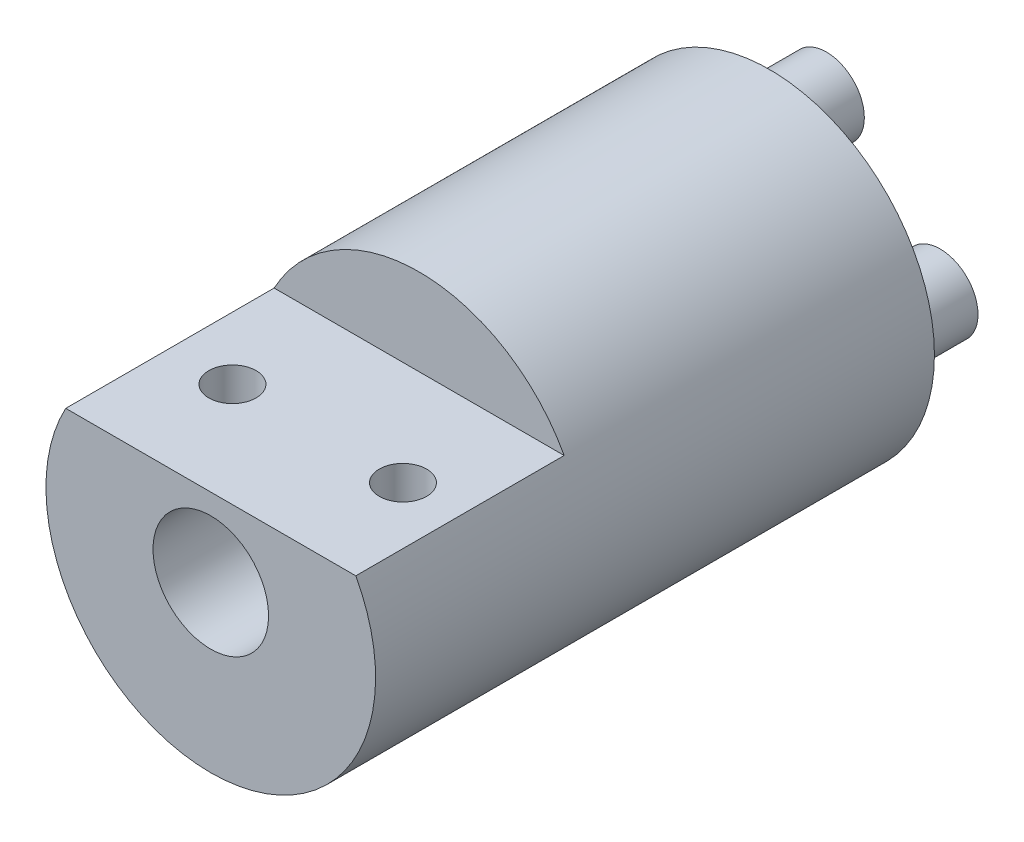
ISO-10303-21;
HEADER;
FILE_DESCRIPTION(('STEP AP214'),'2;1');
FILE_NAME('part.step','',(''),(''),'','','');
FILE_SCHEMA(('AUTOMOTIVE_DESIGN { 1 0 10303 214 1 1 1 1 }'));
ENDSEC;
DATA;
#1=APPLICATION_CONTEXT('core data for automotive mechanical design processes');
#2=APPLICATION_PROTOCOL_DEFINITION('international standard','automotive_design',2000,#1);
#3=PRODUCT_CONTEXT('',#1,'mechanical');
#4=PRODUCT('Part','Part','',(#3));
#5=PRODUCT_RELATED_PRODUCT_CATEGORY('part','',(#4));
#6=PRODUCT_DEFINITION_FORMATION('','',#4);
#7=PRODUCT_DEFINITION_CONTEXT('part definition',#1,'design');
#8=PRODUCT_DEFINITION('design','',#6,#7);
#9=PRODUCT_DEFINITION_SHAPE('','',#8);
#10=(LENGTH_UNIT() NAMED_UNIT(*) SI_UNIT(.MILLI.,.METRE.));
#11=(NAMED_UNIT(*) PLANE_ANGLE_UNIT() SI_UNIT($,.RADIAN.));
#12=(NAMED_UNIT(*) SI_UNIT($,.STERADIAN.) SOLID_ANGLE_UNIT());
#13=UNCERTAINTY_MEASURE_WITH_UNIT(LENGTH_MEASURE(1.E-05),#10,'distance_accuracy_value','');
#14=(GEOMETRIC_REPRESENTATION_CONTEXT(3) GLOBAL_UNCERTAINTY_ASSIGNED_CONTEXT((#13)) GLOBAL_UNIT_ASSIGNED_CONTEXT((#10,
#11,#12)) REPRESENTATION_CONTEXT('',''));
#15=CARTESIAN_POINT('',(0.,0.,0.));
#16=DIRECTION('',(0.,0.,1.));
#17=DIRECTION('',(1.,0.,0.));
#18=AXIS2_PLACEMENT_3D('',#15,#16,#17);
#19=CARTESIAN_POINT('',(0.,0.,29.5));
#20=DIRECTION('',(0.,0.,-1.));
#21=DIRECTION('',(-1.,0.,0.));
#22=AXIS2_PLACEMENT_3D('',#19,#20,#21);
#23=CYLINDRICAL_SURFACE('',#22,1.75);
#24=CARTESIAN_POINT('',(0.,0.,2.7));
#25=DIRECTION('',(0.,0.,1.));
#26=DIRECTION('',(1.,0.,0.));
#27=AXIS2_PLACEMENT_3D('',#24,#25,#26);
#28=CIRCLE('',#27,1.75);
#29=CARTESIAN_POINT('',(1.75,0.,2.7));
#30=VERTEX_POINT('',#29);
#31=EDGE_CURVE('E96',#30,#30,#28,.T.);
#32=ORIENTED_EDGE('',*,*,#31,.T.);
#33=EDGE_LOOP('',(#32));
#34=FACE_BOUND('',#33,.T.);
#35=CARTESIAN_POINT('',(0.,0.,0.));
#36=DIRECTION('',(0.,0.,-1.));
#37=DIRECTION('',(-1.,0.,0.));
#38=AXIS2_PLACEMENT_3D('',#35,#36,#37);
#39=CIRCLE('',#38,1.75);
#40=CARTESIAN_POINT('',(-1.75,0.,0.));
#41=VERTEX_POINT('',#40);
#42=EDGE_CURVE('E87',#41,#41,#39,.T.);
#43=ORIENTED_EDGE('',*,*,#42,.T.);
#44=EDGE_LOOP('',(#43));
#45=FACE_BOUND('',#44,.T.);
#46=ADVANCED_FACE('F35',(#34,#45),#23,.F.);
#47=CARTESIAN_POINT('',(0.,0.,29.5));
#48=DIRECTION('',(0.,0.,-1.));
#49=DIRECTION('',(-1.,0.,0.));
#50=AXIS2_PLACEMENT_3D('',#47,#48,#49);
#51=CYLINDRICAL_SURFACE('',#50,8.7);
#52=CARTESIAN_POINT('',(4.64445354346428,-7.35656518237976,25.25));
#53=CARTESIAN_POINT('',(4.73428230230111,-7.29984922243143,25.2499983136137));
#54=CARTESIAN_POINT('',(4.82314577905018,-7.2414214920152,25.2403108379036));
#55=CARTESIAN_POINT('',(4.99618931123596,-7.12314110640561,25.2027704708671));
#56=CARTESIAN_POINT('',(5.08035622320646,-7.06328506205961,25.1748691285672));
#57=CARTESIAN_POINT('',(5.23709976608238,-6.94778668937354,25.1037511868211));
#58=CARTESIAN_POINT('',(5.31005914949701,-6.8920935616727,25.0614604777866));
#59=CARTESIAN_POINT('',(5.44746861487665,-6.78400224565856,24.9616938314708));
#60=CARTESIAN_POINT('',(5.51193557488742,-6.73159763369121,24.9042487165379));
#61=CARTESIAN_POINT('',(5.61247164751777,-6.6477912175443,24.7932781396885));
#62=CARTESIAN_POINT('',(5.65133098499533,-6.61473024986206,24.7435228607141));
#63=CARTESIAN_POINT('',(5.72212601356684,-6.55358307905767,24.6365683333737));
#64=CARTESIAN_POINT('',(5.75407214642718,-6.52548938523095,24.5793805232828));
#65=CARTESIAN_POINT('',(5.80407862243175,-6.48101655237665,24.4697593979549));
#66=CARTESIAN_POINT('',(5.82362544498334,-6.46342498298962,24.4185014131565));
#67=CARTESIAN_POINT('',(5.85607411170826,-6.43404059214989,24.312327826374));
#68=CARTESIAN_POINT('',(5.86898090000496,-6.42224345649926,24.2574149802833));
#69=CARTESIAN_POINT('',(5.88733274949459,-6.40542544533612,24.144959137436));
#70=CARTESIAN_POINT('',(5.8927319531199,-6.40044621752588,24.0874021759067));
#71=CARTESIAN_POINT('',(5.89547077483609,-6.39792385227537,23.9719383695255));
#72=CARTESIAN_POINT('',(5.89281267574331,-6.40037860861885,23.9140316284134));
#73=CARTESIAN_POINT('',(5.88031453706711,-6.41186077166845,23.8054686049109));
#74=CARTESIAN_POINT('',(5.87119681650591,-6.42022692943234,23.7546542148956));
#75=CARTESIAN_POINT('',(5.84715372230549,-6.44213135546349,23.6555962475773));
#76=CARTESIAN_POINT('',(5.83222594517264,-6.45567176416327,23.6073537436102));
#77=CARTESIAN_POINT('',(5.79178353899904,-6.49200967224083,23.499595009856));
#78=CARTESIAN_POINT('',(5.76441582800213,-6.51637925823997,23.4413053048167));
#79=CARTESIAN_POINT('',(5.70253292637203,-6.57060229886082,23.3314479577374));
#80=CARTESIAN_POINT('',(5.66800402887095,-6.60046625742357,23.279893520386));
#81=CARTESIAN_POINT('',(5.58212637813299,-6.67337141569234,23.1696468323197));
#82=CARTESIAN_POINT('',(5.52882059737382,-6.71770104980569,23.1133351410025));
#83=CARTESIAN_POINT('',(5.41473924025293,-6.80999269762561,23.0125986124949));
#84=CARTESIAN_POINT('',(5.35395811347325,-6.85795740009235,22.9681826865726));
#85=CARTESIAN_POINT('',(5.22551182965629,-6.95634016347319,22.8906847333513));
#86=CARTESIAN_POINT('',(5.15775364445238,-7.00678490611967,22.8577914194309));
#87=CARTESIAN_POINT('',(5.01757945724512,-7.10783858414738,22.8046352831473));
#88=CARTESIAN_POINT('',(4.94516309441603,-7.15844753195905,22.7843734405298));
#89=CARTESIAN_POINT('',(4.78784248337089,-7.26475325035044,22.7553697948519));
#90=CARTESIAN_POINT('',(4.70250509742069,-7.32030018077561,22.7483737026743));
#91=CARTESIAN_POINT('',(4.53013885869344,-7.42820094909708,22.752259484806));
#92=CARTESIAN_POINT('',(4.44310987202305,-7.48055453286569,22.7631427800434));
#93=CARTESIAN_POINT('',(4.27551026178597,-7.57752283881264,22.8027663898295));
#94=CARTESIAN_POINT('',(4.19485300894461,-7.62240792215602,22.8304605050919));
#95=CARTESIAN_POINT('',(4.03852709516366,-7.7063706368651,22.9032952776762));
#96=CARTESIAN_POINT('',(3.96285241043471,-7.74545535520231,22.9484143978448));
#97=CARTESIAN_POINT('',(3.8307090231521,-7.8115531870406,23.0480649340971));
#98=CARTESIAN_POINT('',(3.773035522625,-7.83949071523474,23.1003853558249));
#99=CARTESIAN_POINT('',(3.66739710700463,-7.88946227952929,23.2164205931179));
#100=CARTESIAN_POINT('',(3.61942318987219,-7.9115017956929,23.2801247391917));
#101=CARTESIAN_POINT('',(3.54120325208682,-7.9467912784543,23.4081885067459));
#102=CARTESIAN_POINT('',(3.50948066909119,-7.96080140401013,23.4714407597));
#103=CARTESIAN_POINT('',(3.45699188303596,-7.98373559751052,23.6031956144013));
#104=CARTESIAN_POINT('',(3.43622011334944,-7.9926622497225,23.6716955282829));
#105=CARTESIAN_POINT('',(3.40773007893375,-8.00484840453101,23.8065647969642));
#106=CARTESIAN_POINT('',(3.39916947997701,-8.00847409166782,23.8727245513899));
#107=CARTESIAN_POINT('',(3.39269787183453,-8.01121809913537,24.0056507693258));
#108=CARTESIAN_POINT('',(3.39478455158121,-8.01033739760974,24.0724170980344));
#109=CARTESIAN_POINT('',(3.4093205911866,-8.00416082818338,24.2028321941144));
#110=CARTESIAN_POINT('',(3.42149946050284,-7.9989802009672,24.2665168958011));
#111=CARTESIAN_POINT('',(3.45536613556074,-7.98440866320842,24.39079265559));
#112=CARTESIAN_POINT('',(3.47705379740851,-7.97501781637784,24.4513837604911));
#113=CARTESIAN_POINT('',(3.52934766517927,-7.95201387607259,24.5685027701869));
#114=CARTESIAN_POINT('',(3.56004550108902,-7.9383573053611,24.6249810937992));
#115=CARTESIAN_POINT('',(3.62907392856331,-7.90703829819907,24.7318135829642));
#116=CARTESIAN_POINT('',(3.66740533499117,-7.8893754340594,24.7821670937842));
#117=CARTESIAN_POINT('',(3.7522278518746,-7.84939984398766,24.8779001673907));
#118=CARTESIAN_POINT('',(3.79901299741492,-7.82691073092812,24.9229447992096));
#119=CARTESIAN_POINT('',(3.89776909474198,-7.77820206669523,25.0045245274185));
#120=CARTESIAN_POINT('',(3.94974245108749,-7.75198078336838,25.0410556516885));
#121=CARTESIAN_POINT('',(4.06183113668097,-7.69388320320528,25.1080017173438));
#122=CARTESIAN_POINT('',(4.12226293250346,-7.66171551941535,25.1376311975812));
#123=CARTESIAN_POINT('',(4.24543121382601,-7.59415858454735,25.1864528626467));
#124=CARTESIAN_POINT('',(4.30816693121404,-7.5587704014497,25.2056484929251));
#125=CARTESIAN_POINT('',(4.41673000242853,-7.49568348641555,25.2299657532556));
#126=CARTESIAN_POINT('',(4.46238878582518,-7.46859577643746,25.2375203034684));
#127=CARTESIAN_POINT('',(4.55359807559967,-7.41333894036498,25.2475379555902));
#128=CARTESIAN_POINT('',(4.59914857750075,-7.38516977035715,25.2500008505257));
#129=CARTESIAN_POINT('',(4.64445354346428,-7.35656518237976,25.25));
#130=B_SPLINE_CURVE_WITH_KNOTS('',3,(#52,#53,#54,#55,#56,#57,#58,#59,#60,#61,#62,#63,#64,#65,
#66,#67,#68,#69,#70,#71,#72,#73,#74,#75,#76,#77,#78,#79,#80,#81,#82,#83,#84,#85,#86,#87,#88,#89,
#90,#91,#92,#93,#94,#95,#96,#97,#98,#99,#100,#101,#102,#103,#104,#105,#106,#107,#108,#109,#110,
#111,#112,#113,#114,#115,#116,#117,#118,#119,#120,#121,#122,#123,#124,#125,#126,#127,#128,#129),
.UNSPECIFIED.,.T.,.F.,(4,2,2,2,2,2,2,2,2,2,2,2,2,2,2,2,2,2,2,2,2,2,2,2,2,2,2,2,2,2,2,2,2,2,2,2,
2,2,4),(0.,0.318485737291532,0.637822154582836,0.939609839498168,1.24078839233826,
1.45385301696372,1.66659354527921,1.83873587250942,2.01074983756832,2.18380994441862,
2.35682102400451,2.51303517855027,2.66931402428598,2.87474611828589,3.08057510973482,
3.34712090760407,3.61386582332706,3.88479492661968,4.15574504160374,4.46038594886415,
4.76505106801207,5.05246213925762,5.33951910400319,5.586271805926,5.83279443836164,
6.04805794681692,6.26321192460609,6.46265706128621,6.66205890882224,6.85628296835599,
7.05050408885304,7.24677316875705,7.44306321110345,7.64837403869649,7.85378046658134,
8.07667389580225,8.2994936767021,8.46011483164744,8.62074251563972),.UNSPECIFIED.);
#131=CARTESIAN_POINT('',(4.64445354346428,-7.35656518237976,25.25));
#132=VERTEX_POINT('',#131);
#133=EDGE_CURVE('E107',#132,#132,#130,.T.);
#134=ORIENTED_EDGE('',*,*,#133,.T.);
#135=EDGE_LOOP('',(#134));
#136=FACE_BOUND('',#135,.T.);
#137=CARTESIAN_POINT('',(-4.35554645653572,-7.53121604158048,25.25));
#138=CARTESIAN_POINT('',(-4.28149878792105,-7.57403985078422,25.2499988824262));
#139=CARTESIAN_POINT('',(-4.20679899775351,-7.6157720088627,25.2434172999534));
#140=CARTESIAN_POINT('',(-4.058121338259,-7.69602383094756,25.2164465241141));
#141=CARTESIAN_POINT('',(-3.98414341685853,-7.73454372821252,25.1960583342979));
#142=CARTESIAN_POINT('',(-3.83901906859396,-7.8075966939334,25.1409439535076));
#143=CARTESIAN_POINT('',(-3.76788983037047,-7.84210742418347,25.1061419391379));
#144=CARTESIAN_POINT('',(-3.63192021432966,-7.90599758290411,25.0223639350081));
#145=CARTESIAN_POINT('',(-3.56707611267814,-7.93538005814271,24.9733964074525));
#146=CARTESIAN_POINT('',(-3.45309068809177,-7.98559036582203,24.8680263907658));
#147=CARTESIAN_POINT('',(-3.403021384501,-8.00698604983009,24.8128983850275));
#148=CARTESIAN_POINT('',(-3.31287797876676,-8.04470220268777,24.6934889195014));
#149=CARTESIAN_POINT('',(-3.27279774697054,-8.06102578548573,24.6292131113693));
#150=CARTESIAN_POINT('',(-3.20777259685441,-8.08710779781152,24.4998649060389));
#151=CARTESIAN_POINT('',(-3.18177054031545,-8.09733386209012,24.4354162488737));
#152=CARTESIAN_POINT('',(-3.14073715017222,-8.1133384408927,24.3025950232929));
#153=CARTESIAN_POINT('',(-3.12570217766223,-8.11911843066997,24.2342237645355));
#154=CARTESIAN_POINT('',(-3.10770192323431,-8.1260246466137,24.0990465618681));
#155=CARTESIAN_POINT('',(-3.10419120597139,-8.12736121821751,24.0323233543174));
#156=CARTESIAN_POINT('',(-3.10783924048391,-8.12596698689866,23.899216522887));
#157=CARTESIAN_POINT('',(-3.11499661459986,-8.12323670916216,23.8328328562704));
#158=CARTESIAN_POINT('',(-3.13952852029316,-8.11378627715154,23.7031892582125));
#159=CARTESIAN_POINT('',(-3.15676797607309,-8.10711885987948,23.6398997975745));
#160=CARTESIAN_POINT('',(-3.20068562928489,-8.08988035802883,23.5172585748369));
#161=CARTESIAN_POINT('',(-3.22736391032928,-8.0793092388698,23.4579068476246));
#162=CARTESIAN_POINT('',(-3.28961835843051,-8.05416348708958,23.3438112937849));
#163=CARTESIAN_POINT('',(-3.32532164067727,-8.03953133982351,23.2891496634429));
#164=CARTESIAN_POINT('',(-3.40409496677691,-8.00649471425805,23.1867246788442));
#165=CARTESIAN_POINT('',(-3.44716605566785,-7.98808970074772,23.1389623049419));
#166=CARTESIAN_POINT('',(-3.54127451350286,-7.94683116418959,23.0492769205815));
#167=CARTESIAN_POINT('',(-3.5925838775501,-7.9238142286656,23.0077152183754));
#168=CARTESIAN_POINT('',(-3.699888900641,-7.87428188390073,22.933761787893));
#169=CARTESIAN_POINT('',(-3.75588591487718,-7.84776546167739,22.9013727233564));
#170=CARTESIAN_POINT('',(-3.87550593292527,-7.78943004826004,22.8437943518028));
#171=CARTESIAN_POINT('',(-3.93938069184815,-7.75735660195547,22.8193877867825));
#172=CARTESIAN_POINT('',(-4.06878585960677,-7.69027326452496,22.7814676707415));
#173=CARTESIAN_POINT('',(-4.13431697913613,-7.65526209743806,22.7679588803495));
#174=CARTESIAN_POINT('',(-4.27265001751912,-7.57900754201518,22.750598024024));
#175=CARTESIAN_POINT('',(-4.34546050863245,-7.53750189370464,22.7479686247479));
#176=CARTESIAN_POINT('',(-4.48938692212858,-7.45267725421673,22.7550962889707));
#177=CARTESIAN_POINT('',(-4.56050214329249,-7.40935753242356,22.7648583904406));
#178=CARTESIAN_POINT('',(-4.70721575394475,-7.31713164912699,22.797882969872));
#179=CARTESIAN_POINT('',(-4.78245207249042,-7.26813328827647,22.8225069846222));
#180=CARTESIAN_POINT('',(-4.92738169490002,-7.17067304207176,22.8856560397245));
#181=CARTESIAN_POINT('',(-4.99706784244223,-7.1222119165343,22.9241986834273));
#182=CARTESIAN_POINT('',(-5.13174031437103,-7.02583586020076,23.016652249668));
#183=CARTESIAN_POINT('',(-5.19641593592393,-6.97802516326073,23.0711294977359));
#184=CARTESIAN_POINT('',(-5.31512710158141,-6.88802918069736,23.1944024250924));
#185=CARTESIAN_POINT('',(-5.36918991769288,-6.84582956871627,23.2631604444022));
#186=CARTESIAN_POINT('',(-5.44687989098039,-6.78402925327167,23.3877535517193));
#187=CARTESIAN_POINT('',(-5.47454434347002,-6.76168133970736,23.4397246939205));
#188=CARTESIAN_POINT('',(-5.52277650634889,-6.72234380609106,23.548760679754));
#189=CARTESIAN_POINT('',(-5.54335112681032,-6.70534897008307,23.6058204950473));
#190=CARTESIAN_POINT('',(-5.57633397356231,-6.67794671715438,23.7243408271815));
#191=CARTESIAN_POINT('',(-5.58867457277922,-6.66759387782214,23.785833298911));
#192=CARTESIAN_POINT('',(-5.60394145601439,-6.6547687662612,23.9107807417552));
#193=CARTESIAN_POINT('',(-5.60687466462078,-6.65229069758695,23.9742342346494));
#194=CARTESIAN_POINT('',(-5.60333517184121,-6.6552709784949,24.0926632263129));
#195=CARTESIAN_POINT('',(-5.59799726629332,-6.65977187131449,24.1477028296556));
#196=CARTESIAN_POINT('',(-5.58031434568902,-6.67459536231319,24.2558215090887));
#197=CARTESIAN_POINT('',(-5.56796868521173,-6.68491849672572,24.3089004041163));
#198=CARTESIAN_POINT('',(-5.53687983276616,-6.71069046084524,24.4121642555695));
#199=CARTESIAN_POINT('',(-5.51809925111089,-6.72616923203743,24.4623302484028));
#200=CARTESIAN_POINT('',(-5.47500815035938,-6.76129122797592,24.5586545118619));
#201=CARTESIAN_POINT('',(-5.45069410735352,-6.78093710594314,24.6048102025867));
#202=CARTESIAN_POINT('',(-5.38585488482925,-6.83263747879325,24.7115957394805));
#203=CARTESIAN_POINT('',(-5.34285612284773,-6.86639368630915,24.7699070306361));
#204=CARTESIAN_POINT('',(-5.24919553901837,-6.93825921107654,24.876906325849));
#205=CARTESIAN_POINT('',(-5.19852154155506,-6.97637542087525,24.9255787510452));
#206=CARTESIAN_POINT('',(-5.09035826441648,-7.05569331739473,25.0136451353217));
#207=CARTESIAN_POINT('',(-5.03278745787571,-7.09692924072274,25.0529073762566));
#208=CARTESIAN_POINT('',(-4.91268326175511,-7.18059197855184,25.1211007726175));
#209=CARTESIAN_POINT('',(-4.85015155631513,-7.22301838576966,25.150035415897));
#210=CARTESIAN_POINT('',(-4.71738413097553,-7.31046988360632,25.1986923816817));
#211=CARTESIAN_POINT('',(-4.64691138202164,-7.35549922429417,25.2177632502662));
#212=CARTESIAN_POINT('',(-4.50302567704536,-7.44445522884208,25.2434185422925));
#213=CARTESIAN_POINT('',(-4.42961228753875,-7.48838172856658,25.250001117848));
#214=CARTESIAN_POINT('',(-4.35554645653572,-7.53121604158048,25.25));
#215=B_SPLINE_CURVE_WITH_KNOTS('',3,(#137,#138,#139,#140,#141,#142,#143,#144,#145,#146,#147,
#148,#149,#150,#151,#152,#153,#154,#155,#156,#157,#158,#159,#160,#161,#162,#163,#164,#165,#166,
#167,#168,#169,#170,#171,#172,#173,#174,#175,#176,#177,#178,#179,#180,#181,#182,#183,#184,#185,
#186,#187,#188,#189,#190,#191,#192,#193,#194,#195,#196,#197,#198,#199,#200,#201,#202,#203,#204,
#205,#206,#207,#208,#209,#210,#211,#212,#213,#214),.UNSPECIFIED.,.T.,.F.,(4,2,2,2,2,2,2,2,2,2,2,
2,2,2,2,2,2,2,2,2,2,2,2,2,2,2,2,2,2,2,2,2,2,2,2,2,2,2,4),(0.,0.256354012468136,
0.512689393529676,0.770390698269475,1.02793837400122,1.25911786387568,1.49015514249363,
1.69981973094638,1.90941472048425,2.1089347352682,2.30842898660295,2.50530981037036,
2.7021923782227,2.90201966410702,3.10187531671453,3.31076028448924,3.5197058505303,
3.74535814046612,3.97110895197533,4.22163818513199,4.47226930775334,4.75035105872889,
5.02878574774849,5.31865944443633,5.60777820314424,5.79600067095043,5.98403916625164,
6.17360363552678,6.36302853820439,6.52866853488512,6.69432378964269,6.86095837132265,
7.02769937040053,7.2661935422056,7.50507009054243,7.74711702856553,7.98908214457701,
8.24546110217311,8.50187799307103),.UNSPECIFIED.);
#216=CARTESIAN_POINT('',(-4.35554645653572,-7.53121604158048,25.25));
#217=VERTEX_POINT('',#216);
#218=EDGE_CURVE('E100',#217,#217,#215,.T.);
#219=ORIENTED_EDGE('',*,*,#218,.T.);
#220=EDGE_LOOP('',(#219));
#221=FACE_BOUND('',#220,.T.);
#222=CARTESIAN_POINT('',(0.,0.,29.5));
#223=DIRECTION('',(0.,0.,1.));
#224=DIRECTION('',(1.,0.,0.));
#225=AXIS2_PLACEMENT_3D('',#222,#223,#224);
#226=CIRCLE('',#225,8.7);
#227=CARTESIAN_POINT('',(-7.65554645653572,4.1331112314845,29.5));
#228=VERTEX_POINT('',#227);
#229=CARTESIAN_POINT('',(7.65554645653572,4.1331112314845,29.5));
#230=VERTEX_POINT('',#229);
#231=EDGE_CURVE('E67',#228,#230,#226,.T.);
#232=ORIENTED_EDGE('',*,*,#231,.F.);
#233=DIRECTION('',(0.,0.,1.));
#234=VECTOR('',#233,1.);
#235=CARTESIAN_POINT('',(-7.65554645653572,4.1331112314845,18.5));
#236=LINE('',#235,#234);
#237=CARTESIAN_POINT('',(-7.65554645653572,4.1331112314845,18.5));
#238=VERTEX_POINT('',#237);
#239=EDGE_CURVE('E50',#238,#228,#236,.T.);
#240=ORIENTED_EDGE('',*,*,#239,.F.);
#241=CARTESIAN_POINT('',(0.,0.,18.5));
#242=DIRECTION('',(0.,0.,1.));
#243=DIRECTION('',(1.,0.,0.));
#244=AXIS2_PLACEMENT_3D('',#241,#242,#243);
#245=CIRCLE('',#244,8.7);
#246=CARTESIAN_POINT('',(7.65554645653572,4.1331112314845,18.5));
#247=VERTEX_POINT('',#246);
#248=EDGE_CURVE('E57',#247,#238,#245,.T.);
#249=ORIENTED_EDGE('',*,*,#248,.F.);
#250=DIRECTION('',(0.,0.,-1.));
#251=VECTOR('',#250,1.);
#252=CARTESIAN_POINT('',(7.65554645653572,4.1331112314845,29.5));
#253=LINE('',#252,#251);
#254=EDGE_CURVE('E70',#247,#230,#253,.F.);
#255=ORIENTED_EDGE('',*,*,#254,.T.);
#256=EDGE_LOOP('',(#232,#240,#249,#255));
#257=FACE_BOUND('',#256,.T.);
#258=CARTESIAN_POINT('',(0.,0.,0.));
#259=DIRECTION('',(0.,0.,1.));
#260=DIRECTION('',(1.,0.,0.));
#261=AXIS2_PLACEMENT_3D('',#258,#259,#260);
#262=CIRCLE('',#261,8.7);
#263=CARTESIAN_POINT('',(8.7,0.,0.));
#264=VERTEX_POINT('',#263);
#265=EDGE_CURVE('E90',#264,#264,#262,.T.);
#266=ORIENTED_EDGE('',*,*,#265,.T.);
#267=EDGE_LOOP('',(#266));
#268=FACE_BOUND('',#267,.T.);
#269=ADVANCED_FACE('F74',(#136,#221,#257,#268),#51,.T.);
#270=CARTESIAN_POINT('',(0.,0.,29.5));
#271=DIRECTION('',(0.,0.,1.));
#272=DIRECTION('',(1.,0.,0.));
#273=AXIS2_PLACEMENT_3D('',#270,#271,#272);
#274=PLANE('',#273);
#275=DIRECTION('',(1.,0.,0.));
#276=VECTOR('',#275,1.);
#277=CARTESIAN_POINT('',(-7.65554645653572,4.1331112314845,29.5));
#278=LINE('',#277,#276);
#279=EDGE_CURVE('E71',#228,#230,#278,.T.);
#280=ORIENTED_EDGE('',*,*,#279,.F.);
#281=ORIENTED_EDGE('',*,*,#231,.T.);
#282=EDGE_LOOP('',(#280,#281));
#283=FACE_BOUND('',#282,.T.);
#284=CARTESIAN_POINT('',(0.,0.,29.5));
#285=DIRECTION('',(0.,0.,1.));
#286=DIRECTION('',(1.,0.,0.));
#287=AXIS2_PLACEMENT_3D('',#284,#285,#286);
#288=CIRCLE('',#287,3.05);
#289=CARTESIAN_POINT('',(3.05,0.,29.5));
#290=VERTEX_POINT('',#289);
#291=EDGE_CURVE('E78',#290,#290,#288,.T.);
#292=ORIENTED_EDGE('',*,*,#291,.F.);
#293=EDGE_LOOP('',(#292));
#294=FACE_BOUND('',#293,.T.);
#295=ADVANCED_FACE('F139',(#283,#294),#274,.T.);
#296=CARTESIAN_POINT('',(0.,0.,0.));
#297=DIRECTION('',(0.,0.,1.));
#298=DIRECTION('',(1.,0.,0.));
#299=AXIS2_PLACEMENT_3D('',#296,#297,#298);
#300=PLANE('',#299);
#301=CARTESIAN_POINT('',(6.,0.,0.));
#302=DIRECTION('',(0.,0.,1.));
#303=DIRECTION('',(1.,0.,0.));
#304=AXIS2_PLACEMENT_3D('',#301,#302,#303);
#305=CIRCLE('',#304,2.);
#306=CARTESIAN_POINT('',(8.,0.,0.));
#307=VERTEX_POINT('',#306);
#308=EDGE_CURVE('E12',#307,#307,#305,.F.);
#309=ORIENTED_EDGE('',*,*,#308,.F.);
#310=EDGE_LOOP('',(#309));
#311=FACE_BOUND('',#310,.T.);
#312=CARTESIAN_POINT('',(0.,-6.,0.));
#313=DIRECTION('',(0.,0.,1.));
#314=DIRECTION('',(1.,0.,0.));
#315=AXIS2_PLACEMENT_3D('',#312,#313,#314);
#316=CIRCLE('',#315,2.);
#317=CARTESIAN_POINT('',(2.,-6.,0.));
#318=VERTEX_POINT('',#317);
#319=EDGE_CURVE('E43',#318,#318,#316,.F.);
#320=ORIENTED_EDGE('',*,*,#319,.F.);
#321=EDGE_LOOP('',(#320));
#322=FACE_BOUND('',#321,.T.);
#323=CARTESIAN_POINT('',(-6.,0.,0.));
#324=DIRECTION('',(0.,0.,1.));
#325=DIRECTION('',(1.,0.,0.));
#326=AXIS2_PLACEMENT_3D('',#323,#324,#325);
#327=CIRCLE('',#326,2.);
#328=CARTESIAN_POINT('',(-4.,0.,0.));
#329=VERTEX_POINT('',#328);
#330=EDGE_CURVE('E154',#329,#329,#327,.F.);
#331=ORIENTED_EDGE('',*,*,#330,.F.);
#332=EDGE_LOOP('',(#331));
#333=FACE_BOUND('',#332,.T.);
#334=CARTESIAN_POINT('',(0.,6.,0.));
#335=DIRECTION('',(0.,0.,1.));
#336=DIRECTION('',(1.,0.,0.));
#337=AXIS2_PLACEMENT_3D('',#334,#335,#336);
#338=CIRCLE('',#337,2.);
#339=CARTESIAN_POINT('',(2.,6.,0.));
#340=VERTEX_POINT('',#339);
#341=EDGE_CURVE('E99',#340,#340,#338,.F.);
#342=ORIENTED_EDGE('',*,*,#341,.F.);
#343=EDGE_LOOP('',(#342));
#344=FACE_BOUND('',#343,.T.);
#345=ORIENTED_EDGE('',*,*,#42,.F.);
#346=EDGE_LOOP('',(#345));
#347=FACE_BOUND('',#346,.T.);
#348=ORIENTED_EDGE('',*,*,#265,.F.);
#349=EDGE_LOOP('',(#348));
#350=FACE_BOUND('',#349,.T.);
#351=ADVANCED_FACE('F131',(#311,#322,#333,#344,#347,#350),#300,.F.);
#352=CARTESIAN_POINT('',(0.,0.,3.));
#353=DIRECTION('',(0.,0.,1.));
#354=DIRECTION('',(1.,0.,0.));
#355=AXIS2_PLACEMENT_3D('',#352,#353,#354);
#356=PLANE('',#355);
#357=CARTESIAN_POINT('',(0.,0.,3.));
#358=DIRECTION('',(0.,0.,1.));
#359=DIRECTION('',(1.,0.,0.));
#360=AXIS2_PLACEMENT_3D('',#357,#358,#359);
#361=CIRCLE('',#360,2.05);
#362=CARTESIAN_POINT('',(2.05,0.,3.));
#363=VERTEX_POINT('',#362);
#364=EDGE_CURVE('E66',#363,#363,#361,.F.);
#365=ORIENTED_EDGE('',*,*,#364,.T.);
#366=EDGE_LOOP('',(#365));
#367=FACE_BOUND('',#366,.T.);
#368=CARTESIAN_POINT('',(0.,0.,3.));
#369=DIRECTION('',(0.,0.,1.));
#370=DIRECTION('',(1.,0.,0.));
#371=AXIS2_PLACEMENT_3D('',#368,#369,#370);
#372=CIRCLE('',#371,3.05);
#373=CARTESIAN_POINT('',(3.05,0.,3.));
#374=VERTEX_POINT('',#373);
#375=EDGE_CURVE('E84',#374,#374,#372,.F.);
#376=ORIENTED_EDGE('',*,*,#375,.F.);
#377=EDGE_LOOP('',(#376));
#378=FACE_BOUND('',#377,.T.);
#379=ADVANCED_FACE('F128',(#367,#378),#356,.T.);
#380=CARTESIAN_POINT('',(0.,0.,-8.62670273047588));
#381=DIRECTION('',(0.,0.,1.));
#382=DIRECTION('',(1.,0.,0.));
#383=AXIS2_PLACEMENT_3D('',#380,#381,#382);
#384=CYLINDRICAL_SURFACE('',#383,3.05);
#385=ORIENTED_EDGE('',*,*,#375,.T.);
#386=EDGE_LOOP('',(#385));
#387=FACE_BOUND('',#386,.T.);
#388=ORIENTED_EDGE('',*,*,#291,.T.);
#389=EDGE_LOOP('',(#388));
#390=FACE_BOUND('',#389,.T.);
#391=ADVANCED_FACE('F124',(#387,#390),#384,.F.);
#392=CARTESIAN_POINT('',(0.,0.,18.5));
#393=DIRECTION('',(0.,0.,1.));
#394=DIRECTION('',(1.,0.,0.));
#395=AXIS2_PLACEMENT_3D('',#392,#393,#394);
#396=PLANE('',#395);
#397=DIRECTION('',(1.,0.,0.));
#398=VECTOR('',#397,1.);
#399=CARTESIAN_POINT('',(-7.65554645653572,4.1331112314845,18.5));
#400=LINE('',#399,#398);
#401=EDGE_CURVE('E65',#238,#247,#400,.T.);
#402=ORIENTED_EDGE('',*,*,#401,.T.);
#403=ORIENTED_EDGE('',*,*,#248,.T.);
#404=EDGE_LOOP('',(#402,#403));
#405=FACE_BOUND('',#404,.T.);
#406=ADVANCED_FACE('F64',(#405),#396,.T.);
#407=CARTESIAN_POINT('',(-7.65554645653572,4.1331112314845,18.5));
#408=DIRECTION('',(0.,-1.,0.));
#409=DIRECTION('',(0.,0.,-1.));
#410=AXIS2_PLACEMENT_3D('',#407,#408,#409);
#411=PLANE('',#410);
#412=CARTESIAN_POINT('',(4.64445354346428,4.1331112314845,24.));
#413=DIRECTION('',(0.,1.,0.));
#414=DIRECTION('',(0.,0.,1.));
#415=AXIS2_PLACEMENT_3D('',#412,#413,#414);
#416=CIRCLE('',#415,1.25);
#417=CARTESIAN_POINT('',(4.64445354346428,4.1331112314845,25.25));
#418=VERTEX_POINT('',#417);
#419=EDGE_CURVE('E171',#418,#418,#416,.T.);
#420=ORIENTED_EDGE('',*,*,#419,.F.);
#421=EDGE_LOOP('',(#420));
#422=FACE_BOUND('',#421,.T.);
#423=CARTESIAN_POINT('',(-4.35554645653572,4.1331112314845,24.));
#424=DIRECTION('',(0.,1.,0.));
#425=DIRECTION('',(0.,0.,1.));
#426=AXIS2_PLACEMENT_3D('',#423,#424,#425);
#427=CIRCLE('',#426,1.25);
#428=CARTESIAN_POINT('',(-4.35554645653572,4.1331112314845,25.25));
#429=VERTEX_POINT('',#428);
#430=EDGE_CURVE('E106',#429,#429,#427,.T.);
#431=ORIENTED_EDGE('',*,*,#430,.F.);
#432=EDGE_LOOP('',(#431));
#433=FACE_BOUND('',#432,.T.);
#434=ORIENTED_EDGE('',*,*,#401,.F.);
#435=ORIENTED_EDGE('',*,*,#239,.T.);
#436=ORIENTED_EDGE('',*,*,#279,.T.);
#437=ORIENTED_EDGE('',*,*,#254,.F.);
#438=EDGE_LOOP('',(#434,#435,#436,#437));
#439=FACE_BOUND('',#438,.T.);
#440=ADVANCED_FACE('F69',(#422,#433,#439),#411,.F.);
#441=CARTESIAN_POINT('',(0.,0.,2.7));
#442=DIRECTION('',(0.,0.,1.));
#443=DIRECTION('',(1.,0.,0.));
#444=AXIS2_PLACEMENT_3D('',#441,#442,#443);
#445=TOROIDAL_SURFACE('',#444,2.05,0.3);
#446=ORIENTED_EDGE('',*,*,#31,.F.);
#447=EDGE_LOOP('',(#446));
#448=FACE_BOUND('',#447,.T.);
#449=ORIENTED_EDGE('',*,*,#364,.F.);
#450=EDGE_LOOP('',(#449));
#451=FACE_BOUND('',#450,.T.);
#452=ADVANCED_FACE('F37',(#448,#451),#445,.T.);
#453=CARTESIAN_POINT('',(-4.35554645653572,4.1331112314845,24.));
#454=DIRECTION('',(0.,1.,0.));
#455=DIRECTION('',(0.,0.,1.));
#456=AXIS2_PLACEMENT_3D('',#453,#454,#455);
#457=CYLINDRICAL_SURFACE('',#456,1.25);
#458=ORIENTED_EDGE('',*,*,#430,.T.);
#459=EDGE_LOOP('',(#458));
#460=FACE_BOUND('',#459,.T.);
#461=ORIENTED_EDGE('',*,*,#218,.F.);
#462=EDGE_LOOP('',(#461));
#463=FACE_BOUND('',#462,.T.);
#464=ADVANCED_FACE('F114',(#460,#463),#457,.F.);
#465=CARTESIAN_POINT('',(4.64445354346428,4.1331112314845,24.));
#466=DIRECTION('',(0.,1.,0.));
#467=DIRECTION('',(0.,0.,1.));
#468=AXIS2_PLACEMENT_3D('',#465,#466,#467);
#469=CYLINDRICAL_SURFACE('',#468,1.25);
#470=ORIENTED_EDGE('',*,*,#419,.T.);
#471=EDGE_LOOP('',(#470));
#472=FACE_BOUND('',#471,.T.);
#473=ORIENTED_EDGE('',*,*,#133,.F.);
#474=EDGE_LOOP('',(#473));
#475=FACE_BOUND('',#474,.T.);
#476=ADVANCED_FACE('F118',(#472,#475),#469,.F.);
#477=CARTESIAN_POINT('',(0.,6.,-3.));
#478=DIRECTION('',(0.,0.,1.));
#479=DIRECTION('',(1.,0.,0.));
#480=AXIS2_PLACEMENT_3D('',#477,#478,#479);
#481=CYLINDRICAL_SURFACE('',#480,2.);
#482=CARTESIAN_POINT('',(0.,6.,-3.));
#483=DIRECTION('',(0.,0.,-1.));
#484=DIRECTION('',(-1.,0.,0.));
#485=AXIS2_PLACEMENT_3D('',#482,#483,#484);
#486=CIRCLE('',#485,2.);
#487=CARTESIAN_POINT('',(-2.,6.,-3.));
#488=VERTEX_POINT('',#487);
#489=EDGE_CURVE('E175',#488,#488,#486,.T.);
#490=ORIENTED_EDGE('',*,*,#489,.F.);
#491=EDGE_LOOP('',(#490));
#492=FACE_BOUND('',#491,.T.);
#493=ORIENTED_EDGE('',*,*,#341,.T.);
#494=EDGE_LOOP('',(#493));
#495=FACE_BOUND('',#494,.T.);
#496=ADVANCED_FACE('F221',(#492,#495),#481,.T.);
#497=CARTESIAN_POINT('',(0.,6.,-3.));
#498=DIRECTION('',(0.,0.,-1.));
#499=DIRECTION('',(-1.,0.,0.));
#500=AXIS2_PLACEMENT_3D('',#497,#498,#499);
#501=PLANE('',#500);
#502=ORIENTED_EDGE('',*,*,#489,.T.);
#503=EDGE_LOOP('',(#502));
#504=FACE_BOUND('',#503,.T.);
#505=ADVANCED_FACE('F218',(#504),#501,.T.);
#506=CARTESIAN_POINT('',(-6.,0.,-3.));
#507=DIRECTION('',(0.,0.,1.));
#508=DIRECTION('',(1.,0.,0.));
#509=AXIS2_PLACEMENT_3D('',#506,#507,#508);
#510=CYLINDRICAL_SURFACE('',#509,2.);
#511=CARTESIAN_POINT('',(-6.,0.,-3.));
#512=DIRECTION('',(0.,0.,-1.));
#513=DIRECTION('',(-1.,0.,0.));
#514=AXIS2_PLACEMENT_3D('',#511,#512,#513);
#515=CIRCLE('',#514,2.);
#516=CARTESIAN_POINT('',(-8.,0.,-3.));
#517=VERTEX_POINT('',#516);
#518=EDGE_CURVE('E180',#517,#517,#515,.T.);
#519=ORIENTED_EDGE('',*,*,#518,.F.);
#520=EDGE_LOOP('',(#519));
#521=FACE_BOUND('',#520,.T.);
#522=ORIENTED_EDGE('',*,*,#330,.T.);
#523=EDGE_LOOP('',(#522));
#524=FACE_BOUND('',#523,.T.);
#525=ADVANCED_FACE('F214',(#521,#524),#510,.T.);
#526=CARTESIAN_POINT('',(-6.,0.,-3.));
#527=DIRECTION('',(0.,0.,-1.));
#528=DIRECTION('',(-1.,0.,0.));
#529=AXIS2_PLACEMENT_3D('',#526,#527,#528);
#530=PLANE('',#529);
#531=ORIENTED_EDGE('',*,*,#518,.T.);
#532=EDGE_LOOP('',(#531));
#533=FACE_BOUND('',#532,.T.);
#534=ADVANCED_FACE('F210',(#533),#530,.T.);
#535=CARTESIAN_POINT('',(0.,-6.,-3.));
#536=DIRECTION('',(0.,0.,1.));
#537=DIRECTION('',(1.,0.,0.));
#538=AXIS2_PLACEMENT_3D('',#535,#536,#537);
#539=CYLINDRICAL_SURFACE('',#538,2.);
#540=CARTESIAN_POINT('',(0.,-6.,-3.));
#541=DIRECTION('',(0.,0.,-1.));
#542=DIRECTION('',(-1.,0.,0.));
#543=AXIS2_PLACEMENT_3D('',#540,#541,#542);
#544=CIRCLE('',#543,2.);
#545=CARTESIAN_POINT('',(-2.,-6.,-3.));
#546=VERTEX_POINT('',#545);
#547=EDGE_CURVE('E185',#546,#546,#544,.T.);
#548=ORIENTED_EDGE('',*,*,#547,.F.);
#549=EDGE_LOOP('',(#548));
#550=FACE_BOUND('',#549,.T.);
#551=ORIENTED_EDGE('',*,*,#319,.T.);
#552=EDGE_LOOP('',(#551));
#553=FACE_BOUND('',#552,.T.);
#554=ADVANCED_FACE('F204',(#550,#553),#539,.T.);
#555=CARTESIAN_POINT('',(0.,-6.,-3.));
#556=DIRECTION('',(0.,0.,-1.));
#557=DIRECTION('',(-1.,0.,0.));
#558=AXIS2_PLACEMENT_3D('',#555,#556,#557);
#559=PLANE('',#558);
#560=ORIENTED_EDGE('',*,*,#547,.T.);
#561=EDGE_LOOP('',(#560));
#562=FACE_BOUND('',#561,.T.);
#563=ADVANCED_FACE('F197',(#562),#559,.T.);
#564=CARTESIAN_POINT('',(6.,0.,-3.));
#565=DIRECTION('',(0.,0.,1.));
#566=DIRECTION('',(1.,0.,0.));
#567=AXIS2_PLACEMENT_3D('',#564,#565,#566);
#568=CYLINDRICAL_SURFACE('',#567,2.);
#569=CARTESIAN_POINT('',(6.,0.,-3.));
#570=DIRECTION('',(0.,0.,-1.));
#571=DIRECTION('',(-1.,0.,0.));
#572=AXIS2_PLACEMENT_3D('',#569,#570,#571);
#573=CIRCLE('',#572,2.);
#574=CARTESIAN_POINT('',(4.,0.,-3.));
#575=VERTEX_POINT('',#574);
#576=EDGE_CURVE('E188',#575,#575,#573,.T.);
#577=ORIENTED_EDGE('',*,*,#576,.F.);
#578=EDGE_LOOP('',(#577));
#579=FACE_BOUND('',#578,.T.);
#580=ORIENTED_EDGE('',*,*,#308,.T.);
#581=EDGE_LOOP('',(#580));
#582=FACE_BOUND('',#581,.T.);
#583=ADVANCED_FACE('F194',(#579,#582),#568,.T.);
#584=CARTESIAN_POINT('',(6.,0.,-3.));
#585=DIRECTION('',(0.,0.,-1.));
#586=DIRECTION('',(-1.,0.,0.));
#587=AXIS2_PLACEMENT_3D('',#584,#585,#586);
#588=PLANE('',#587);
#589=ORIENTED_EDGE('',*,*,#576,.T.);
#590=EDGE_LOOP('',(#589));
#591=FACE_BOUND('',#590,.T.);
#592=ADVANCED_FACE('F192',(#591),#588,.T.);
#593=CLOSED_SHELL('',(#46,#269,#295,#351,#379,#391,#406,#440,#452,#464,#476,#496,#505,#525,#534,
#554,#563,#583,#592));
#594=MANIFOLD_SOLID_BREP('B2',#593);
#595=ADVANCED_BREP_SHAPE_REPRESENTATION('',(#18,#594),#14);
#596=SHAPE_DEFINITION_REPRESENTATION(#9,#595);
ENDSEC;
END-ISO-10303-21;
